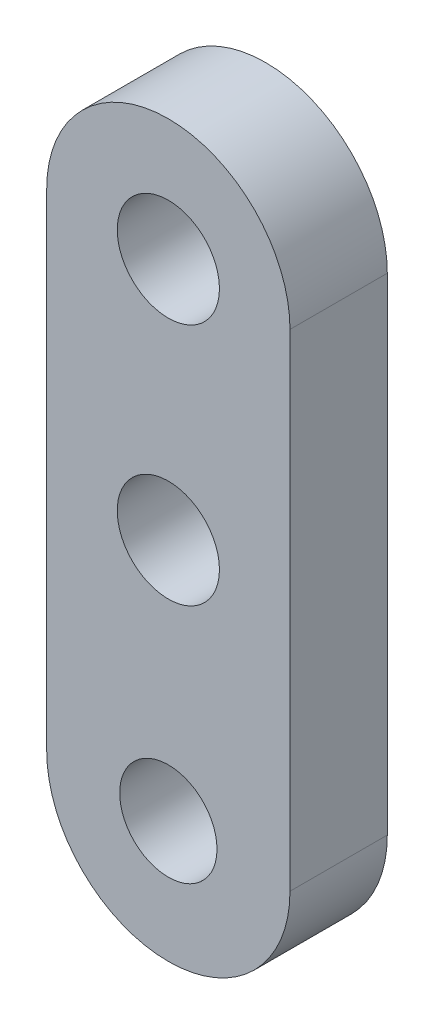
ISO-10303-21;
HEADER;
FILE_DESCRIPTION(('STEP AP214'),'2;1');
FILE_NAME('part.step','',(''),(''),'','','');
FILE_SCHEMA(('AUTOMOTIVE_DESIGN { 1 0 10303 214 1 1 1 1 }'));
ENDSEC;
DATA;
#1=APPLICATION_CONTEXT('core data for automotive mechanical design processes');
#2=APPLICATION_PROTOCOL_DEFINITION('international standard','automotive_design',2000,#1);
#3=PRODUCT_CONTEXT('',#1,'mechanical');
#4=PRODUCT('Part','Part','',(#3));
#5=PRODUCT_RELATED_PRODUCT_CATEGORY('part','',(#4));
#6=PRODUCT_DEFINITION_FORMATION('','',#4);
#7=PRODUCT_DEFINITION_CONTEXT('part definition',#1,'design');
#8=PRODUCT_DEFINITION('design','',#6,#7);
#9=PRODUCT_DEFINITION_SHAPE('','',#8);
#10=(LENGTH_UNIT() NAMED_UNIT(*) SI_UNIT(.MILLI.,.METRE.));
#11=(NAMED_UNIT(*) PLANE_ANGLE_UNIT() SI_UNIT($,.RADIAN.));
#12=(NAMED_UNIT(*) SI_UNIT($,.STERADIAN.) SOLID_ANGLE_UNIT());
#13=UNCERTAINTY_MEASURE_WITH_UNIT(LENGTH_MEASURE(1.E-05),#10,'distance_accuracy_value','');
#14=(GEOMETRIC_REPRESENTATION_CONTEXT(3) GLOBAL_UNCERTAINTY_ASSIGNED_CONTEXT((#13)) GLOBAL_UNIT_ASSIGNED_CONTEXT((#10,
#11,#12)) REPRESENTATION_CONTEXT('',''));
#15=CARTESIAN_POINT('',(0.,0.,0.));
#16=DIRECTION('',(0.,0.,1.));
#17=DIRECTION('',(1.,0.,0.));
#18=AXIS2_PLACEMENT_3D('',#15,#16,#17);
#19=CARTESIAN_POINT('',(0.,0.,2.));
#20=DIRECTION('',(0.,0.,1.));
#21=DIRECTION('',(1.,0.,0.));
#22=AXIS2_PLACEMENT_3D('',#19,#20,#21);
#23=PLANE('',#22);
#24=CARTESIAN_POINT('',(0.,10.,2.));
#25=DIRECTION('',(0.,0.,1.));
#26=DIRECTION('',(1.,0.,0.));
#27=AXIS2_PLACEMENT_3D('',#24,#25,#26);
#28=CIRCLE('',#27,1.05);
#29=CARTESIAN_POINT('',(1.05,10.,2.));
#30=VERTEX_POINT('',#29);
#31=EDGE_CURVE('E134',#30,#30,#28,.T.);
#32=ORIENTED_EDGE('',*,*,#31,.F.);
#33=EDGE_LOOP('',(#32));
#34=FACE_BOUND('',#33,.T.);
#35=CARTESIAN_POINT('',(0.,0.,2.));
#36=DIRECTION('',(0.,0.,1.));
#37=DIRECTION('',(1.,0.,0.));
#38=AXIS2_PLACEMENT_3D('',#35,#36,#37);
#39=CIRCLE('',#38,2.5);
#40=CARTESIAN_POINT('',(-2.5,0.,2.));
#41=VERTEX_POINT('',#40);
#42=CARTESIAN_POINT('',(2.5,0.,2.));
#43=VERTEX_POINT('',#42);
#44=EDGE_CURVE('E92',#41,#43,#39,.T.);
#45=ORIENTED_EDGE('',*,*,#44,.T.);
#46=DIRECTION('',(0.,1.,0.));
#47=VECTOR('',#46,1.);
#48=CARTESIAN_POINT('',(2.5,0.,2.));
#49=LINE('',#48,#47);
#50=CARTESIAN_POINT('',(2.5,10.,2.));
#51=VERTEX_POINT('',#50);
#52=EDGE_CURVE('E87',#43,#51,#49,.T.);
#53=ORIENTED_EDGE('',*,*,#52,.T.);
#54=CARTESIAN_POINT('',(0.,10.,2.));
#55=DIRECTION('',(0.,0.,1.));
#56=DIRECTION('',(1.,0.,0.));
#57=AXIS2_PLACEMENT_3D('',#54,#55,#56);
#58=CIRCLE('',#57,2.5);
#59=CARTESIAN_POINT('',(-2.5,10.,2.));
#60=VERTEX_POINT('',#59);
#61=EDGE_CURVE('E90',#51,#60,#58,.T.);
#62=ORIENTED_EDGE('',*,*,#61,.T.);
#63=DIRECTION('',(0.,-1.,0.));
#64=VECTOR('',#63,1.);
#65=CARTESIAN_POINT('',(-2.5,0.,2.));
#66=LINE('',#65,#64);
#67=EDGE_CURVE('E57',#60,#41,#66,.T.);
#68=ORIENTED_EDGE('',*,*,#67,.T.);
#69=EDGE_LOOP('',(#45,#53,#62,#68));
#70=FACE_BOUND('',#69,.T.);
#71=CARTESIAN_POINT('',(0.,0.,2.));
#72=DIRECTION('',(0.,0.,1.));
#73=DIRECTION('',(1.,0.,0.));
#74=AXIS2_PLACEMENT_3D('',#71,#72,#73);
#75=CIRCLE('',#74,1.);
#76=CARTESIAN_POINT('',(1.,0.,2.));
#77=VERTEX_POINT('',#76);
#78=EDGE_CURVE('E112',#77,#77,#75,.T.);
#79=ORIENTED_EDGE('',*,*,#78,.F.);
#80=EDGE_LOOP('',(#79));
#81=FACE_BOUND('',#80,.T.);
#82=CARTESIAN_POINT('',(0.,5.,2.));
#83=DIRECTION('',(0.,0.,1.));
#84=DIRECTION('',(1.,0.,0.));
#85=AXIS2_PLACEMENT_3D('',#82,#83,#84);
#86=CIRCLE('',#85,1.05);
#87=CARTESIAN_POINT('',(1.05,5.,2.));
#88=VERTEX_POINT('',#87);
#89=EDGE_CURVE('E142',#88,#88,#86,.T.);
#90=ORIENTED_EDGE('',*,*,#89,.F.);
#91=EDGE_LOOP('',(#90));
#92=FACE_BOUND('',#91,.T.);
#93=ADVANCED_FACE('F39',(#34,#70,#81,#92),#23,.T.);
#94=CARTESIAN_POINT('',(0.,0.,0.));
#95=DIRECTION('',(0.,0.,1.));
#96=DIRECTION('',(1.,0.,0.));
#97=AXIS2_PLACEMENT_3D('',#94,#95,#96);
#98=PLANE('',#97);
#99=CARTESIAN_POINT('',(0.,0.,0.));
#100=DIRECTION('',(0.,0.,1.));
#101=DIRECTION('',(1.,0.,0.));
#102=AXIS2_PLACEMENT_3D('',#99,#100,#101);
#103=CIRCLE('',#102,2.5);
#104=CARTESIAN_POINT('',(-2.5,0.,0.));
#105=VERTEX_POINT('',#104);
#106=CARTESIAN_POINT('',(2.5,0.,0.));
#107=VERTEX_POINT('',#106);
#108=EDGE_CURVE('E108',#105,#107,#103,.T.);
#109=ORIENTED_EDGE('',*,*,#108,.F.);
#110=DIRECTION('',(0.,-1.,0.));
#111=VECTOR('',#110,1.);
#112=CARTESIAN_POINT('',(-2.5,0.,0.));
#113=LINE('',#112,#111);
#114=CARTESIAN_POINT('',(-2.5,10.,0.));
#115=VERTEX_POINT('',#114);
#116=EDGE_CURVE('E80',#115,#105,#113,.T.);
#117=ORIENTED_EDGE('',*,*,#116,.F.);
#118=CARTESIAN_POINT('',(0.,10.,0.));
#119=DIRECTION('',(0.,0.,1.));
#120=DIRECTION('',(1.,0.,0.));
#121=AXIS2_PLACEMENT_3D('',#118,#119,#120);
#122=CIRCLE('',#121,2.5);
#123=CARTESIAN_POINT('',(2.5,10.,0.));
#124=VERTEX_POINT('',#123);
#125=EDGE_CURVE('E74',#124,#115,#122,.T.);
#126=ORIENTED_EDGE('',*,*,#125,.F.);
#127=DIRECTION('',(0.,1.,0.));
#128=VECTOR('',#127,1.);
#129=CARTESIAN_POINT('',(2.5,0.,0.));
#130=LINE('',#129,#128);
#131=EDGE_CURVE('E97',#107,#124,#130,.T.);
#132=ORIENTED_EDGE('',*,*,#131,.F.);
#133=EDGE_LOOP('',(#109,#117,#126,#132));
#134=FACE_BOUND('',#133,.T.);
#135=CARTESIAN_POINT('',(0.,0.,0.));
#136=DIRECTION('',(0.,0.,1.));
#137=DIRECTION('',(1.,0.,0.));
#138=AXIS2_PLACEMENT_3D('',#135,#136,#137);
#139=CIRCLE('',#138,1.);
#140=CARTESIAN_POINT('',(1.,0.,0.));
#141=VERTEX_POINT('',#140);
#142=EDGE_CURVE('E130',#141,#141,#139,.T.);
#143=ORIENTED_EDGE('',*,*,#142,.T.);
#144=EDGE_LOOP('',(#143));
#145=FACE_BOUND('',#144,.T.);
#146=CARTESIAN_POINT('',(0.,10.,0.));
#147=DIRECTION('',(0.,0.,1.));
#148=DIRECTION('',(1.,0.,0.));
#149=AXIS2_PLACEMENT_3D('',#146,#147,#148);
#150=CIRCLE('',#149,1.05);
#151=CARTESIAN_POINT('',(1.05,10.,0.));
#152=VERTEX_POINT('',#151);
#153=EDGE_CURVE('E138',#152,#152,#150,.T.);
#154=ORIENTED_EDGE('',*,*,#153,.T.);
#155=EDGE_LOOP('',(#154));
#156=FACE_BOUND('',#155,.T.);
#157=CARTESIAN_POINT('',(0.,5.,0.));
#158=DIRECTION('',(0.,0.,1.));
#159=DIRECTION('',(1.,0.,0.));
#160=AXIS2_PLACEMENT_3D('',#157,#158,#159);
#161=CIRCLE('',#160,1.05);
#162=CARTESIAN_POINT('',(1.05,5.,0.));
#163=VERTEX_POINT('',#162);
#164=EDGE_CURVE('E146',#163,#163,#161,.T.);
#165=ORIENTED_EDGE('',*,*,#164,.T.);
#166=EDGE_LOOP('',(#165));
#167=FACE_BOUND('',#166,.T.);
#168=ADVANCED_FACE('F125',(#134,#145,#156,#167),#98,.F.);
#169=CARTESIAN_POINT('',(0.,0.,2.));
#170=DIRECTION('',(0.,0.,-1.));
#171=DIRECTION('',(-1.,0.,0.));
#172=AXIS2_PLACEMENT_3D('',#169,#170,#171);
#173=CYLINDRICAL_SURFACE('',#172,2.5);
#174=ORIENTED_EDGE('',*,*,#108,.T.);
#175=DIRECTION('',(0.,0.,-1.));
#176=VECTOR('',#175,1.);
#177=CARTESIAN_POINT('',(2.5,0.,2.));
#178=LINE('',#177,#176);
#179=EDGE_CURVE('E11',#43,#107,#178,.T.);
#180=ORIENTED_EDGE('',*,*,#179,.F.);
#181=ORIENTED_EDGE('',*,*,#44,.F.);
#182=DIRECTION('',(0.,0.,-1.));
#183=VECTOR('',#182,1.);
#184=CARTESIAN_POINT('',(-2.5,0.,2.));
#185=LINE('',#184,#183);
#186=EDGE_CURVE('E104',#41,#105,#185,.T.);
#187=ORIENTED_EDGE('',*,*,#186,.T.);
#188=EDGE_LOOP('',(#174,#180,#181,#187));
#189=FACE_BOUND('',#188,.T.);
#190=ADVANCED_FACE('F41',(#189),#173,.T.);
#191=CARTESIAN_POINT('',(2.5,0.,2.));
#192=DIRECTION('',(-1.,0.,0.));
#193=DIRECTION('',(0.,0.,1.));
#194=AXIS2_PLACEMENT_3D('',#191,#192,#193);
#195=PLANE('',#194);
#196=ORIENTED_EDGE('',*,*,#131,.T.);
#197=DIRECTION('',(0.,0.,-1.));
#198=VECTOR('',#197,1.);
#199=CARTESIAN_POINT('',(2.5,10.,2.));
#200=LINE('',#199,#198);
#201=EDGE_CURVE('E49',#51,#124,#200,.T.);
#202=ORIENTED_EDGE('',*,*,#201,.F.);
#203=ORIENTED_EDGE('',*,*,#52,.F.);
#204=ORIENTED_EDGE('',*,*,#179,.T.);
#205=EDGE_LOOP('',(#196,#202,#203,#204));
#206=FACE_BOUND('',#205,.T.);
#207=ADVANCED_FACE('F96',(#206),#195,.F.);
#208=CARTESIAN_POINT('',(0.,10.,2.));
#209=DIRECTION('',(0.,0.,-1.));
#210=DIRECTION('',(-1.,0.,0.));
#211=AXIS2_PLACEMENT_3D('',#208,#209,#210);
#212=CYLINDRICAL_SURFACE('',#211,2.5);
#213=ORIENTED_EDGE('',*,*,#125,.T.);
#214=DIRECTION('',(0.,0.,-1.));
#215=VECTOR('',#214,1.);
#216=CARTESIAN_POINT('',(-2.5,10.,2.));
#217=LINE('',#216,#215);
#218=EDGE_CURVE('E99',#60,#115,#217,.T.);
#219=ORIENTED_EDGE('',*,*,#218,.F.);
#220=ORIENTED_EDGE('',*,*,#61,.F.);
#221=ORIENTED_EDGE('',*,*,#201,.T.);
#222=EDGE_LOOP('',(#213,#219,#220,#221));
#223=FACE_BOUND('',#222,.T.);
#224=ADVANCED_FACE('F100',(#223),#212,.T.);
#225=CARTESIAN_POINT('',(-2.5,0.,2.));
#226=DIRECTION('',(1.,0.,0.));
#227=DIRECTION('',(0.,0.,-1.));
#228=AXIS2_PLACEMENT_3D('',#225,#226,#227);
#229=PLANE('',#228);
#230=ORIENTED_EDGE('',*,*,#116,.T.);
#231=ORIENTED_EDGE('',*,*,#186,.F.);
#232=ORIENTED_EDGE('',*,*,#67,.F.);
#233=ORIENTED_EDGE('',*,*,#218,.T.);
#234=EDGE_LOOP('',(#230,#231,#232,#233));
#235=FACE_BOUND('',#234,.T.);
#236=ADVANCED_FACE('F122',(#235),#229,.F.);
#237=CARTESIAN_POINT('',(0.,0.,2.));
#238=DIRECTION('',(0.,0.,-1.));
#239=DIRECTION('',(-1.,0.,0.));
#240=AXIS2_PLACEMENT_3D('',#237,#238,#239);
#241=CYLINDRICAL_SURFACE('',#240,1.);
#242=ORIENTED_EDGE('',*,*,#78,.T.);
#243=EDGE_LOOP('',(#242));
#244=FACE_BOUND('',#243,.T.);
#245=ORIENTED_EDGE('',*,*,#142,.F.);
#246=EDGE_LOOP('',(#245));
#247=FACE_BOUND('',#246,.T.);
#248=ADVANCED_FACE('F166',(#244,#247),#241,.F.);
#249=CARTESIAN_POINT('',(0.,10.,2.));
#250=DIRECTION('',(0.,0.,-1.));
#251=DIRECTION('',(-1.,0.,0.));
#252=AXIS2_PLACEMENT_3D('',#249,#250,#251);
#253=CYLINDRICAL_SURFACE('',#252,1.05);
#254=ORIENTED_EDGE('',*,*,#31,.T.);
#255=EDGE_LOOP('',(#254));
#256=FACE_BOUND('',#255,.T.);
#257=ORIENTED_EDGE('',*,*,#153,.F.);
#258=EDGE_LOOP('',(#257));
#259=FACE_BOUND('',#258,.T.);
#260=ADVANCED_FACE('F212',(#256,#259),#253,.F.);
#261=CARTESIAN_POINT('',(0.,5.,2.));
#262=DIRECTION('',(0.,0.,-1.));
#263=DIRECTION('',(-1.,0.,0.));
#264=AXIS2_PLACEMENT_3D('',#261,#262,#263);
#265=CYLINDRICAL_SURFACE('',#264,1.05);
#266=ORIENTED_EDGE('',*,*,#89,.T.);
#267=EDGE_LOOP('',(#266));
#268=FACE_BOUND('',#267,.T.);
#269=ORIENTED_EDGE('',*,*,#164,.F.);
#270=EDGE_LOOP('',(#269));
#271=FACE_BOUND('',#270,.T.);
#272=ADVANCED_FACE('F154',(#268,#271),#265,.F.);
#273=CLOSED_SHELL('',(#93,#168,#190,#207,#224,#236,#248,#260,#272));
#274=MANIFOLD_SOLID_BREP('B2',#273);
#275=ADVANCED_BREP_SHAPE_REPRESENTATION('',(#18,#274),#14);
#276=SHAPE_DEFINITION_REPRESENTATION(#9,#275);
ENDSEC;
END-ISO-10303-21;
